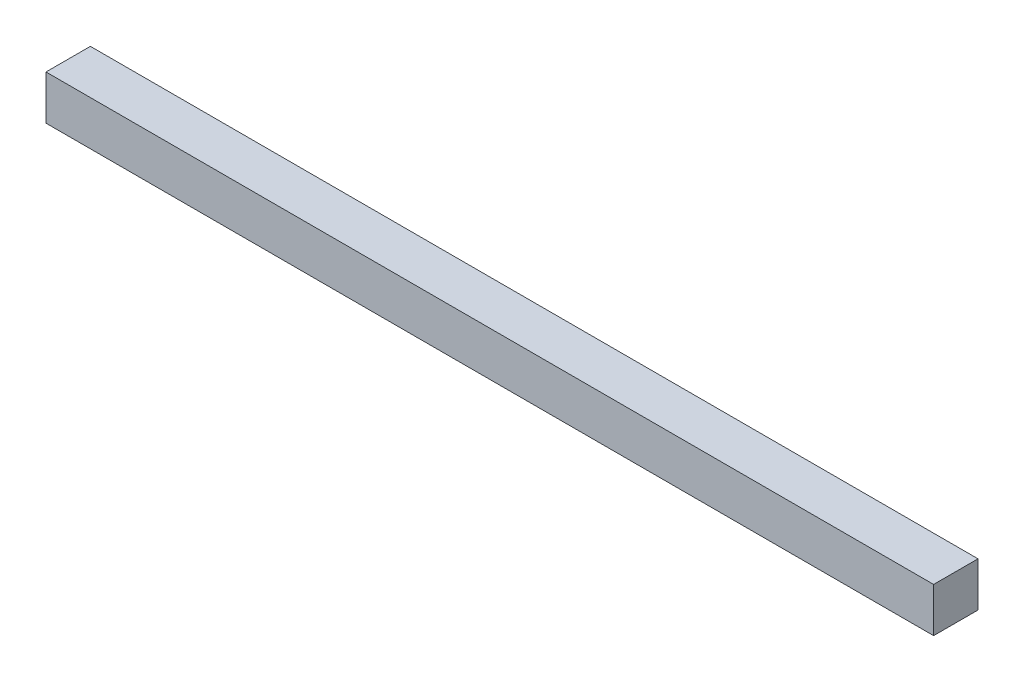
ISO-10303-21;
HEADER;
FILE_DESCRIPTION(('STEP AP214'),'2;1');
FILE_NAME('part.step','',(''),(''),'','','');
FILE_SCHEMA(('AUTOMOTIVE_DESIGN { 1 0 10303 214 1 1 1 1 }'));
ENDSEC;
DATA;
#1=APPLICATION_CONTEXT('core data for automotive mechanical design processes');
#2=APPLICATION_PROTOCOL_DEFINITION('international standard','automotive_design',2000,#1);
#3=PRODUCT_CONTEXT('',#1,'mechanical');
#4=PRODUCT('Part','Part','',(#3));
#5=PRODUCT_RELATED_PRODUCT_CATEGORY('part','',(#4));
#6=PRODUCT_DEFINITION_FORMATION('','',#4);
#7=PRODUCT_DEFINITION_CONTEXT('part definition',#1,'design');
#8=PRODUCT_DEFINITION('design','',#6,#7);
#9=PRODUCT_DEFINITION_SHAPE('','',#8);
#10=(LENGTH_UNIT() NAMED_UNIT(*) SI_UNIT(.MILLI.,.METRE.));
#11=(NAMED_UNIT(*) PLANE_ANGLE_UNIT() SI_UNIT($,.RADIAN.));
#12=(NAMED_UNIT(*) SI_UNIT($,.STERADIAN.) SOLID_ANGLE_UNIT());
#13=UNCERTAINTY_MEASURE_WITH_UNIT(LENGTH_MEASURE(1.E-05),#10,'distance_accuracy_value','');
#14=(GEOMETRIC_REPRESENTATION_CONTEXT(3) GLOBAL_UNCERTAINTY_ASSIGNED_CONTEXT((#13)) GLOBAL_UNIT_ASSIGNED_CONTEXT((#10,
#11,#12)) REPRESENTATION_CONTEXT('',''));
#15=CARTESIAN_POINT('',(0.,0.,0.));
#16=DIRECTION('',(0.,0.,1.));
#17=DIRECTION('',(1.,0.,0.));
#18=AXIS2_PLACEMENT_3D('',#15,#16,#17);
#19=CARTESIAN_POINT('',(1000.,22.6400762752265,-16.5456856825044));
#20=DIRECTION('',(0.,0.,1.));
#21=DIRECTION('',(0.,-1.,0.));
#22=AXIS2_PLACEMENT_3D('',#19,#20,#21);
#23=PLANE('',#22);
#24=DIRECTION('',(0.,1.,0.));
#25=VECTOR('',#24,1.);
#26=CARTESIAN_POINT('',(0.,22.6400762752265,-16.5456856825044));
#27=LINE('',#26,#25);
#28=CARTESIAN_POINT('',(0.,-27.3599237247735,-16.5456856825044));
#29=VERTEX_POINT('',#28);
#30=CARTESIAN_POINT('',(0.,22.6400762752265,-16.5456856825044));
#31=VERTEX_POINT('',#30);
#32=EDGE_CURVE('E98',#29,#31,#27,.T.);
#33=ORIENTED_EDGE('',*,*,#32,.T.);
#34=DIRECTION('',(-1.,0.,0.));
#35=VECTOR('',#34,1.);
#36=CARTESIAN_POINT('',(1000.,22.6400762752265,-16.5456856825044));
#37=LINE('',#36,#35);
#38=CARTESIAN_POINT('',(1000.,22.6400762752265,-16.5456856825044));
#39=VERTEX_POINT('',#38);
#40=EDGE_CURVE('E11',#39,#31,#37,.T.);
#41=ORIENTED_EDGE('',*,*,#40,.F.);
#42=DIRECTION('',(0.,1.,0.));
#43=VECTOR('',#42,1.);
#44=CARTESIAN_POINT('',(1000.,22.6400762752265,-16.5456856825044));
#45=LINE('',#44,#43);
#46=CARTESIAN_POINT('',(1000.,-27.3599237247735,-16.5456856825044));
#47=VERTEX_POINT('',#46);
#48=EDGE_CURVE('E86',#47,#39,#45,.T.);
#49=ORIENTED_EDGE('',*,*,#48,.F.);
#50=DIRECTION('',(-1.,0.,0.));
#51=VECTOR('',#50,1.);
#52=CARTESIAN_POINT('',(1000.,-27.3599237247735,-16.5456856825044));
#53=LINE('',#52,#51);
#54=EDGE_CURVE('E94',#47,#29,#53,.T.);
#55=ORIENTED_EDGE('',*,*,#54,.T.);
#56=EDGE_LOOP('',(#33,#41,#49,#55));
#57=FACE_BOUND('',#56,.T.);
#58=ADVANCED_FACE('F35',(#57),#23,.F.);
#59=CARTESIAN_POINT('',(1000.,22.6400762752265,-16.5456856825044));
#60=DIRECTION('',(0.,-1.,0.));
#61=DIRECTION('',(0.,0.,-1.));
#62=AXIS2_PLACEMENT_3D('',#59,#60,#61);
#63=PLANE('',#62);
#64=DIRECTION('',(0.,0.,1.));
#65=VECTOR('',#64,1.);
#66=CARTESIAN_POINT('',(0.,22.6400762752265,-16.5456856825044));
#67=LINE('',#66,#65);
#68=CARTESIAN_POINT('',(0.,22.6400762752264,33.4543143174956));
#69=VERTEX_POINT('',#68);
#70=EDGE_CURVE('E90',#31,#69,#67,.T.);
#71=ORIENTED_EDGE('',*,*,#70,.T.);
#72=DIRECTION('',(-1.,0.,0.));
#73=VECTOR('',#72,1.);
#74=CARTESIAN_POINT('',(1000.,22.6400762752264,33.4543143174956));
#75=LINE('',#74,#73);
#76=CARTESIAN_POINT('',(1000.,22.6400762752264,33.4543143174956));
#77=VERTEX_POINT('',#76);
#78=EDGE_CURVE('E43',#77,#69,#75,.T.);
#79=ORIENTED_EDGE('',*,*,#78,.F.);
#80=DIRECTION('',(0.,0.,1.));
#81=VECTOR('',#80,1.);
#82=CARTESIAN_POINT('',(1000.,22.6400762752265,-16.5456856825044));
#83=LINE('',#82,#81);
#84=EDGE_CURVE('E81',#39,#77,#83,.T.);
#85=ORIENTED_EDGE('',*,*,#84,.F.);
#86=ORIENTED_EDGE('',*,*,#40,.T.);
#87=EDGE_LOOP('',(#71,#79,#85,#86));
#88=FACE_BOUND('',#87,.T.);
#89=ADVANCED_FACE('F89',(#88),#63,.F.);
#90=CARTESIAN_POINT('',(1000.,22.6400762752264,33.4543143174956));
#91=DIRECTION('',(0.,0.,-1.));
#92=DIRECTION('',(-1.,0.,0.));
#93=AXIS2_PLACEMENT_3D('',#90,#91,#92);
#94=PLANE('',#93);
#95=DIRECTION('',(0.,-1.,0.));
#96=VECTOR('',#95,1.);
#97=CARTESIAN_POINT('',(0.,22.6400762752264,33.4543143174956));
#98=LINE('',#97,#96);
#99=CARTESIAN_POINT('',(0.,-27.3599237247736,33.4543143174956));
#100=VERTEX_POINT('',#99);
#101=EDGE_CURVE('E68',#69,#100,#98,.T.);
#102=ORIENTED_EDGE('',*,*,#101,.T.);
#103=DIRECTION('',(-1.,0.,0.));
#104=VECTOR('',#103,1.);
#105=CARTESIAN_POINT('',(1000.,-27.3599237247736,33.4543143174956));
#106=LINE('',#105,#104);
#107=CARTESIAN_POINT('',(1000.,-27.3599237247736,33.4543143174956));
#108=VERTEX_POINT('',#107);
#109=EDGE_CURVE('E91',#108,#100,#106,.T.);
#110=ORIENTED_EDGE('',*,*,#109,.F.);
#111=DIRECTION('',(0.,-1.,0.));
#112=VECTOR('',#111,1.);
#113=CARTESIAN_POINT('',(1000.,22.6400762752264,33.4543143174956));
#114=LINE('',#113,#112);
#115=EDGE_CURVE('E84',#77,#108,#114,.T.);
#116=ORIENTED_EDGE('',*,*,#115,.F.);
#117=ORIENTED_EDGE('',*,*,#78,.T.);
#118=EDGE_LOOP('',(#102,#110,#116,#117));
#119=FACE_BOUND('',#118,.T.);
#120=ADVANCED_FACE('F92',(#119),#94,.F.);
#121=CARTESIAN_POINT('',(1000.,-27.3599237247735,-16.5456856825044));
#122=DIRECTION('',(0.,1.,0.));
#123=DIRECTION('',(0.,0.,1.));
#124=AXIS2_PLACEMENT_3D('',#121,#122,#123);
#125=PLANE('',#124);
#126=DIRECTION('',(0.,0.,-1.));
#127=VECTOR('',#126,1.);
#128=CARTESIAN_POINT('',(0.,-27.3599237247735,-16.5456856825044));
#129=LINE('',#128,#127);
#130=EDGE_CURVE('E74',#100,#29,#129,.T.);
#131=ORIENTED_EDGE('',*,*,#130,.T.);
#132=ORIENTED_EDGE('',*,*,#54,.F.);
#133=DIRECTION('',(0.,0.,-1.));
#134=VECTOR('',#133,1.);
#135=CARTESIAN_POINT('',(1000.,-27.3599237247735,-16.5456856825044));
#136=LINE('',#135,#134);
#137=EDGE_CURVE('E51',#108,#47,#136,.T.);
#138=ORIENTED_EDGE('',*,*,#137,.F.);
#139=ORIENTED_EDGE('',*,*,#109,.T.);
#140=EDGE_LOOP('',(#131,#132,#138,#139));
#141=FACE_BOUND('',#140,.T.);
#142=ADVANCED_FACE('F105',(#141),#125,.F.);
#143=CARTESIAN_POINT('',(1000.,0.,0.));
#144=DIRECTION('',(-1.,0.,0.));
#145=DIRECTION('',(0.,0.,1.));
#146=AXIS2_PLACEMENT_3D('',#143,#144,#145);
#147=PLANE('',#146);
#148=ORIENTED_EDGE('',*,*,#48,.T.);
#149=ORIENTED_EDGE('',*,*,#84,.T.);
#150=ORIENTED_EDGE('',*,*,#115,.T.);
#151=ORIENTED_EDGE('',*,*,#137,.T.);
#152=EDGE_LOOP('',(#148,#149,#150,#151));
#153=FACE_BOUND('',#152,.T.);
#154=ADVANCED_FACE('F82',(#153),#147,.F.);
#155=CARTESIAN_POINT('',(0.,0.,0.));
#156=DIRECTION('',(-1.,0.,0.));
#157=DIRECTION('',(0.,0.,1.));
#158=AXIS2_PLACEMENT_3D('',#155,#156,#157);
#159=PLANE('',#158);
#160=ORIENTED_EDGE('',*,*,#32,.F.);
#161=ORIENTED_EDGE('',*,*,#130,.F.);
#162=ORIENTED_EDGE('',*,*,#101,.F.);
#163=ORIENTED_EDGE('',*,*,#70,.F.);
#164=EDGE_LOOP('',(#160,#161,#162,#163));
#165=FACE_BOUND('',#164,.T.);
#166=ADVANCED_FACE('F108',(#165),#159,.T.);
#167=CLOSED_SHELL('',(#58,#89,#120,#142,#154,#166));
#168=MANIFOLD_SOLID_BREP('B2',#167);
#169=ADVANCED_BREP_SHAPE_REPRESENTATION('',(#18,#168),#14);
#170=SHAPE_DEFINITION_REPRESENTATION(#9,#169);
ENDSEC;
END-ISO-10303-21;
